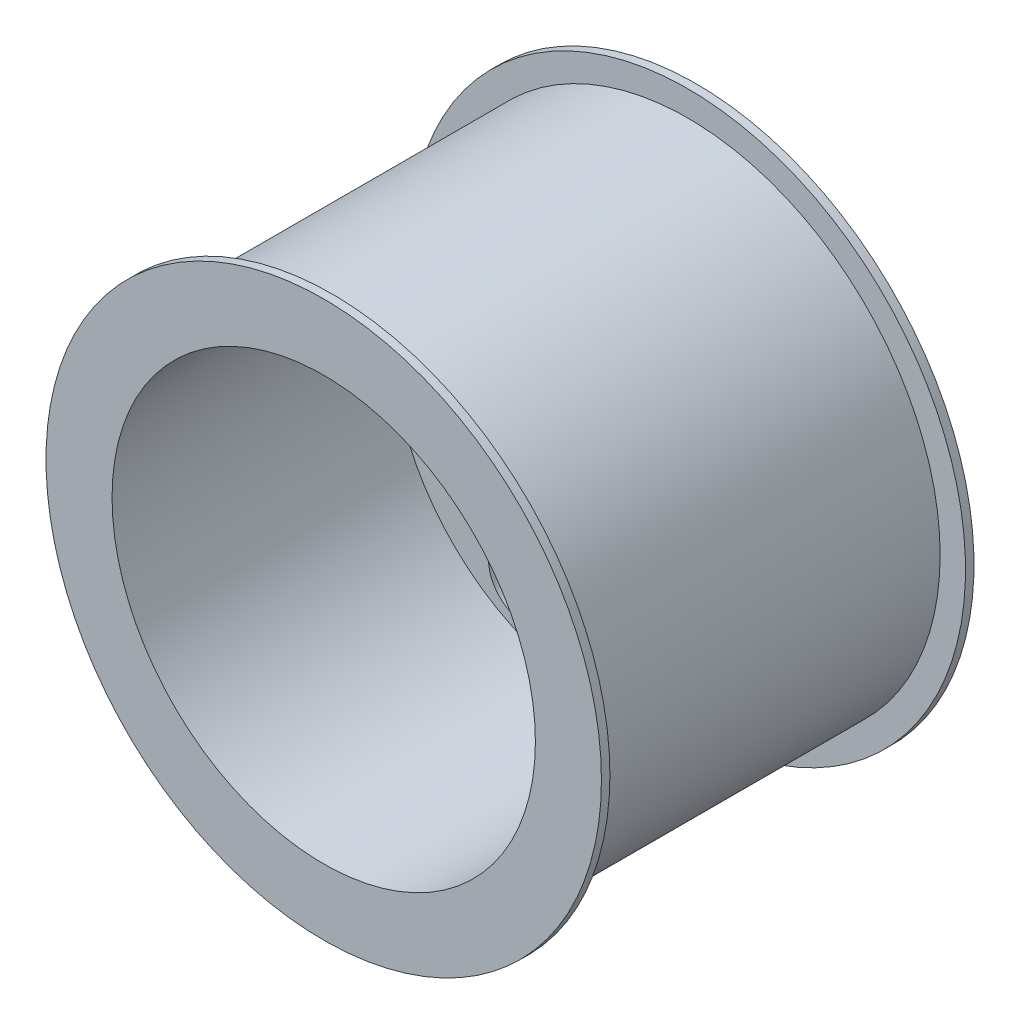
ISO-10303-21;
HEADER;
FILE_DESCRIPTION(('STEP AP214'),'2;1');
FILE_NAME('part.step','',(''),(''),'','','');
FILE_SCHEMA(('AUTOMOTIVE_DESIGN { 1 0 10303 214 1 1 1 1 }'));
ENDSEC;
DATA;
#1=APPLICATION_CONTEXT('core data for automotive mechanical design processes');
#2=APPLICATION_PROTOCOL_DEFINITION('international standard','automotive_design',2000,#1);
#3=PRODUCT_CONTEXT('',#1,'mechanical');
#4=PRODUCT('Part','Part','',(#3));
#5=PRODUCT_RELATED_PRODUCT_CATEGORY('part','',(#4));
#6=PRODUCT_DEFINITION_FORMATION('','',#4);
#7=PRODUCT_DEFINITION_CONTEXT('part definition',#1,'design');
#8=PRODUCT_DEFINITION('design','',#6,#7);
#9=PRODUCT_DEFINITION_SHAPE('','',#8);
#10=(LENGTH_UNIT() NAMED_UNIT(*) SI_UNIT(.MILLI.,.METRE.));
#11=(NAMED_UNIT(*) PLANE_ANGLE_UNIT() SI_UNIT($,.RADIAN.));
#12=(NAMED_UNIT(*) SI_UNIT($,.STERADIAN.) SOLID_ANGLE_UNIT());
#13=UNCERTAINTY_MEASURE_WITH_UNIT(LENGTH_MEASURE(1.E-05),#10,'distance_accuracy_value','');
#14=(GEOMETRIC_REPRESENTATION_CONTEXT(3) GLOBAL_UNCERTAINTY_ASSIGNED_CONTEXT((#13)) GLOBAL_UNIT_ASSIGNED_CONTEXT((#10,
#11,#12)) REPRESENTATION_CONTEXT('',''));
#15=CARTESIAN_POINT('',(0.,0.,0.));
#16=DIRECTION('',(0.,0.,1.));
#17=DIRECTION('',(1.,0.,0.));
#18=AXIS2_PLACEMENT_3D('',#15,#16,#17);
#19=CARTESIAN_POINT('',(0.,0.,1.));
#20=DIRECTION('',(0.,0.,1.));
#21=DIRECTION('',(1.,0.,0.));
#22=AXIS2_PLACEMENT_3D('',#19,#20,#21);
#23=PLANE('',#22);
#24=CARTESIAN_POINT('',(0.,0.,1.));
#25=DIRECTION('',(0.,0.,1.));
#26=DIRECTION('',(1.,0.,0.));
#27=AXIS2_PLACEMENT_3D('',#24,#25,#26);
#28=CIRCLE('',#27,32.8);
#29=CARTESIAN_POINT('',(32.8,0.,1.));
#30=VERTEX_POINT('',#29);
#31=EDGE_CURVE('E119',#30,#30,#28,.T.);
#32=ORIENTED_EDGE('',*,*,#31,.T.);
#33=EDGE_LOOP('',(#32));
#34=FACE_BOUND('',#33,.T.);
#35=CARTESIAN_POINT('',(0.,0.,1.));
#36=DIRECTION('',(0.,0.,1.));
#37=DIRECTION('',(1.,0.,0.));
#38=AXIS2_PLACEMENT_3D('',#35,#36,#37);
#39=CIRCLE('',#38,25.);
#40=CARTESIAN_POINT('',(25.,0.,1.));
#41=VERTEX_POINT('',#40);
#42=EDGE_CURVE('E114',#41,#41,#39,.T.);
#43=ORIENTED_EDGE('',*,*,#42,.F.);
#44=EDGE_LOOP('',(#43));
#45=FACE_BOUND('',#44,.T.);
#46=ADVANCED_FACE('F43',(#34,#45),#23,.T.);
#47=CARTESIAN_POINT('',(0.,0.,0.));
#48=DIRECTION('',(0.,0.,1.));
#49=DIRECTION('',(1.,0.,0.));
#50=AXIS2_PLACEMENT_3D('',#47,#48,#49);
#51=PLANE('',#50);
#52=CARTESIAN_POINT('',(0.,0.,0.));
#53=DIRECTION('',(0.,0.,1.));
#54=DIRECTION('',(1.,0.,0.));
#55=AXIS2_PLACEMENT_3D('',#52,#53,#54);
#56=CIRCLE('',#55,29.8);
#57=CARTESIAN_POINT('',(29.8,0.,0.));
#58=VERTEX_POINT('',#57);
#59=EDGE_CURVE('E113',#58,#58,#56,.T.);
#60=ORIENTED_EDGE('',*,*,#59,.T.);
#61=EDGE_LOOP('',(#60));
#62=FACE_BOUND('',#61,.T.);
#63=CARTESIAN_POINT('',(0.,0.,0.));
#64=DIRECTION('',(0.,0.,1.));
#65=DIRECTION('',(1.,0.,0.));
#66=AXIS2_PLACEMENT_3D('',#63,#64,#65);
#67=CIRCLE('',#66,32.8);
#68=CARTESIAN_POINT('',(32.8,0.,0.));
#69=VERTEX_POINT('',#68);
#70=EDGE_CURVE('E118',#69,#69,#67,.T.);
#71=ORIENTED_EDGE('',*,*,#70,.F.);
#72=EDGE_LOOP('',(#71));
#73=FACE_BOUND('',#72,.T.);
#74=ADVANCED_FACE('F192',(#62,#73),#51,.F.);
#75=CARTESIAN_POINT('',(0.,0.,1.));
#76=DIRECTION('',(0.,0.,-1.));
#77=DIRECTION('',(-1.,0.,0.));
#78=AXIS2_PLACEMENT_3D('',#75,#76,#77);
#79=CYLINDRICAL_SURFACE('',#78,32.8);
#80=ORIENTED_EDGE('',*,*,#31,.F.);
#81=EDGE_LOOP('',(#80));
#82=FACE_BOUND('',#81,.T.);
#83=ORIENTED_EDGE('',*,*,#70,.T.);
#84=EDGE_LOOP('',(#83));
#85=FACE_BOUND('',#84,.T.);
#86=ADVANCED_FACE('F45',(#82,#85),#79,.T.);
#87=CARTESIAN_POINT('',(0.,0.,1.));
#88=DIRECTION('',(0.,0.,-1.));
#89=DIRECTION('',(-1.,0.,0.));
#90=AXIS2_PLACEMENT_3D('',#87,#88,#89);
#91=CYLINDRICAL_SURFACE('',#90,25.);
#92=ORIENTED_EDGE('',*,*,#42,.T.);
#93=EDGE_LOOP('',(#92));
#94=FACE_BOUND('',#93,.T.);
#95=CARTESIAN_POINT('',(0.,0.,-32.));
#96=DIRECTION('',(0.,0.,1.));
#97=DIRECTION('',(1.,0.,0.));
#98=AXIS2_PLACEMENT_3D('',#95,#96,#97);
#99=CIRCLE('',#98,25.);
#100=CARTESIAN_POINT('',(25.,0.,-32.));
#101=VERTEX_POINT('',#100);
#102=EDGE_CURVE('E109',#101,#101,#99,.T.);
#103=ORIENTED_EDGE('',*,*,#102,.F.);
#104=EDGE_LOOP('',(#103));
#105=FACE_BOUND('',#104,.T.);
#106=ADVANCED_FACE('F187',(#94,#105),#91,.F.);
#107=CARTESIAN_POINT('',(0.,0.,-32.));
#108=DIRECTION('',(0.,0.,1.));
#109=DIRECTION('',(1.,0.,0.));
#110=AXIS2_PLACEMENT_3D('',#107,#108,#109);
#111=CYLINDRICAL_SURFACE('',#110,29.8);
#112=CARTESIAN_POINT('',(-27.5808250331206,11.2844180395973,-37.1));
#113=CARTESIAN_POINT('',(-27.5808233058313,11.2844255278698,-36.9323929499502));
#114=CARTESIAN_POINT('',(-27.575447888857,11.2975883421955,-36.7646749268853));
#115=CARTESIAN_POINT('',(-27.5539862225092,11.3498286074411,-36.4339015290692));
#116=CARTESIAN_POINT('',(-27.5378881609234,11.3889346375719,-36.2708515034791));
#117=CARTESIAN_POINT('',(-27.4951603858825,11.4917027589654,-35.9542642315582));
#118=CARTESIAN_POINT('',(-27.4685382642428,11.5553471480039,-35.8007202199531));
#119=CARTESIAN_POINT('',(-27.4050734078043,11.7050643290178,-35.5073373009363));
#120=CARTESIAN_POINT('',(-27.3682325596467,11.7911329807168,-35.3674958701171));
#121=CARTESIAN_POINT('',(-27.2845626824013,11.9834747386879,-35.1045867357193));
#122=CARTESIAN_POINT('',(-27.2376795461966,12.0898569417337,-34.9816160656129));
#123=CARTESIAN_POINT('',(-27.1347294368258,12.3191811671401,-34.7567563531234));
#124=CARTESIAN_POINT('',(-27.0786618585818,12.442124280451,-34.6548687007066));
#125=CARTESIAN_POINT('',(-26.9579511024183,12.7015520616607,-34.4745026304823));
#126=CARTESIAN_POINT('',(-26.893261058046,12.8381096270139,-34.3961603588139));
#127=CARTESIAN_POINT('',(-26.7568496114464,13.1200417932478,-34.2659219527598));
#128=CARTESIAN_POINT('',(-26.6851283158304,13.2654162604297,-34.214025417465));
#129=CARTESIAN_POINT('',(-26.5364962775488,13.5602929729284,-34.138308027073));
#130=CARTESIAN_POINT('',(-26.4595984693177,13.7097844160906,-34.1144197541901));
#131=CARTESIAN_POINT('',(-26.3024811740584,14.0088546505511,-34.0952414605534));
#132=CARTESIAN_POINT('',(-26.222261815146,14.1584334382614,-34.0999503377957));
#133=CARTESIAN_POINT('',(-26.0613190486005,14.4525290218735,-34.137763105333));
#134=CARTESIAN_POINT('',(-25.9806013063596,14.5970702456769,-34.1707012882984));
#135=CARTESIAN_POINT('',(-25.8207439263026,14.8780146921137,-34.2638311692694));
#136=CARTESIAN_POINT('',(-25.7416042787278,15.0144179650807,-34.3240226986917));
#137=CARTESIAN_POINT('',(-25.5876774255549,15.2752641014053,-34.4698417307441));
#138=CARTESIAN_POINT('',(-25.5128842695716,15.3997234758465,-34.5554334301543));
#139=CARTESIAN_POINT('',(-25.370176796521,15.6337116636736,-34.7496585131787));
#140=CARTESIAN_POINT('',(-25.3022626152522,15.7432401823228,-34.8582923515389));
#141=CARTESIAN_POINT('',(-25.1756259017401,15.9449716829662,-35.0959204485136));
#142=CARTESIAN_POINT('',(-25.1169331469343,16.0371187220587,-35.2249780710099));
#143=CARTESIAN_POINT('',(-25.0112686844527,16.2014200348164,-35.4995678004216));
#144=CARTESIAN_POINT('',(-24.9642970916594,16.2735741125258,-35.6451000687892));
#145=CARTESIAN_POINT('',(-24.8838791377055,16.3962793723694,-35.9488196495752));
#146=CARTESIAN_POINT('',(-24.8504577049173,16.4467907478056,-36.1070296509589));
#147=CARTESIAN_POINT('',(-24.798642669892,16.5248157040323,-36.4313823227834));
#148=CARTESIAN_POINT('',(-24.7802488728925,16.5523295828769,-36.5975248903864));
#149=CARTESIAN_POINT('',(-24.7592784747833,16.5836814948811,-36.9327334969352));
#150=CARTESIAN_POINT('',(-24.756675819108,16.5875585276641,-37.1017942584487));
#151=CARTESIAN_POINT('',(-24.7673279698435,16.5716490738568,-37.4382939698992));
#152=CARTESIAN_POINT('',(-24.7805826866052,16.5518627210465,-37.6057329289997));
#153=CARTESIAN_POINT('',(-24.8223686100339,16.4891303436356,-37.9340463079303));
#154=CARTESIAN_POINT('',(-24.8508828015007,16.4462101142681,-38.0949278250753));
#155=CARTESIAN_POINT('',(-24.9219993253665,16.3382405418012,-38.4057820837011));
#156=CARTESIAN_POINT('',(-24.964601861752,16.273190878287,-38.5557546671919));
#157=CARTESIAN_POINT('',(-25.0622636445946,16.1223756012122,-38.8408177753956));
#158=CARTESIAN_POINT('',(-25.1173443744088,16.0365742426102,-38.9758820292758));
#159=CARTESIAN_POINT('',(-25.2377632328754,15.8463857498369,-39.2270193891457));
#160=CARTESIAN_POINT('',(-25.3031014394664,15.7419984744448,-39.3430923508218));
#161=CARTESIAN_POINT('',(-25.4416328257185,15.5171113066712,-39.5530593403544));
#162=CARTESIAN_POINT('',(-25.5148333661481,15.3965962889759,-39.6469323165647));
#163=CARTESIAN_POINT('',(-25.6663798780783,15.142614749635,-39.8096737332536));
#164=CARTESIAN_POINT('',(-25.74472573422,15.0091485183258,-39.8785427341));
#165=CARTESIAN_POINT('',(-25.9036397812163,14.7331839370334,-39.9891511716175));
#166=CARTESIAN_POINT('',(-25.9842013286975,14.5907112118045,-40.0309640829627));
#167=CARTESIAN_POINT('',(-26.1451484865239,14.3003062130653,-40.0865763771767));
#168=CARTESIAN_POINT('',(-26.2255340999795,14.1523740369118,-40.1003762593475));
#169=CARTESIAN_POINT('',(-26.3835390568202,13.8555787932831,-40.0996090170452));
#170=CARTESIAN_POINT('',(-26.461164646919,13.7067188609448,-40.0851107351279));
#171=CARTESIAN_POINT('',(-26.6117713305376,13.411973340826,-40.028353594461));
#172=CARTESIAN_POINT('',(-26.6847523305945,13.2660878129395,-39.9860941772694));
#173=CARTESIAN_POINT('',(-26.824546177643,12.9811020083382,-39.8748913446533));
#174=CARTESIAN_POINT('',(-26.8913395145593,12.8420238049813,-39.8058668630194));
#175=CARTESIAN_POINT('',(-27.017116832952,12.5752603583761,-39.6431162089852));
#176=CARTESIAN_POINT('',(-27.0761007588394,12.4475751962278,-39.5493898607661));
#177=CARTESIAN_POINT('',(-27.1855204925496,12.2067643830115,-39.3392468483135));
#178=CARTESIAN_POINT('',(-27.2359054227944,12.0937262811652,-39.222703339038));
#179=CARTESIAN_POINT('',(-27.3269420484751,11.8865922289364,-38.9704851171803));
#180=CARTESIAN_POINT('',(-27.3675914707601,11.7925007032189,-38.8348059483261));
#181=CARTESIAN_POINT('',(-27.4386212339376,11.6262748628595,-38.5480302370837));
#182=CARTESIAN_POINT('',(-27.4689935568536,11.5541576964941,-38.3969217761772));
#183=CARTESIAN_POINT('',(-27.5190337437166,11.4344667402133,-38.0837540606929));
#184=CARTESIAN_POINT('',(-27.5387140319932,11.3868644669326,-37.9217077634115));
#185=CARTESIAN_POINT('',(-27.5622322621853,11.3297797783758,-37.6489313947057));
#186=CARTESIAN_POINT('',(-27.5692001701338,11.3127960336867,-37.5399732147102));
#187=CARTESIAN_POINT('',(-27.5784971067504,11.29011274149,-37.3206927233836));
#188=CARTESIAN_POINT('',(-27.5808261705528,11.2844131085171,-37.2103704223905));
#189=CARTESIAN_POINT('',(-27.5808250331206,11.2844180395973,-37.1));
#190=B_SPLINE_CURVE_WITH_KNOTS('',3,(#112,#113,#114,#115,#116,#117,#118,#119,#120,#121,#122,
#123,#124,#125,#126,#127,#128,#129,#130,#131,#132,#133,#134,#135,#136,#137,#138,#139,#140,#141,
#142,#143,#144,#145,#146,#147,#148,#149,#150,#151,#152,#153,#154,#155,#156,#157,#158,#159,#160,
#161,#162,#163,#164,#165,#166,#167,#168,#169,#170,#171,#172,#173,#174,#175,#176,#177,#178,#179,
#180,#181,#182,#183,#184,#185,#186,#187,#188,#189),.UNSPECIFIED.,.T.,.F.,(4,2,2,2,2,2,2,2,2,2,2,
2,2,2,2,2,2,2,2,2,2,2,2,2,2,2,2,2,2,2,2,2,2,2,2,2,2,2,4),(0.,0.50241700148323,1.00538838980818,
1.50799760628625,2.01051408980284,2.51580944240425,3.0211380976377,3.52933485044635,
4.03752389891981,4.54448717411758,5.05143091338388,5.55541909306666,6.05940415523036,
6.56268216438254,7.06597010685531,7.57085124632446,8.07573733408052,8.58154809673458,
9.0873523038367,9.59232173273815,10.0972883068302,10.6016929835344,11.1061049638851,
11.6113920665796,12.1166830087405,12.622451200382,13.1282080564822,13.6325856285908,
14.1369542106344,14.6400973157439,15.1432505423722,15.647939778795,16.152632607509,
16.6602151510623,17.1679160951466,17.6760122284256,18.1835166754485,18.5143643137094,
18.8452094461391),.UNSPECIFIED.);
#191=CARTESIAN_POINT('',(-27.5808250331206,11.2844180395973,-37.1));
#192=VERTEX_POINT('',#191);
#193=EDGE_CURVE('E70',#192,#192,#190,.T.);
#194=ORIENTED_EDGE('',*,*,#193,.F.);
#195=EDGE_LOOP('',(#194));
#196=FACE_BOUND('',#195,.T.);
#197=ORIENTED_EDGE('',*,*,#59,.F.);
#198=EDGE_LOOP('',(#197));
#199=FACE_BOUND('',#198,.T.);
#200=CARTESIAN_POINT('',(0.,0.,-42.));
#201=DIRECTION('',(0.,0.,-1.));
#202=DIRECTION('',(-1.,0.,0.));
#203=AXIS2_PLACEMENT_3D('',#200,#201,#202);
#204=CIRCLE('',#203,29.8);
#205=CARTESIAN_POINT('',(-29.8,0.,-42.));
#206=VERTEX_POINT('',#205);
#207=EDGE_CURVE('E104',#206,#206,#204,.T.);
#208=ORIENTED_EDGE('',*,*,#207,.F.);
#209=EDGE_LOOP('',(#208));
#210=FACE_BOUND('',#209,.T.);
#211=ADVANCED_FACE('F136',(#196,#199,#210),#111,.T.);
#212=CARTESIAN_POINT('',(0.,0.,-32.));
#213=DIRECTION('',(0.,0.,-1.));
#214=DIRECTION('',(-1.,0.,0.));
#215=AXIS2_PLACEMENT_3D('',#212,#213,#214);
#216=PLANE('',#215);
#217=CARTESIAN_POINT('',(9.08685125502355,17.1402781269453,-32.));
#218=DIRECTION('',(0.,0.,-1.));
#219=DIRECTION('',(-1.,0.,0.));
#220=AXIS2_PLACEMENT_3D('',#217,#218,#219);
#221=CIRCLE('',#220,4.45000000000122);
#222=CARTESIAN_POINT('',(4.63685125502233,17.1402781269453,-32.));
#223=VERTEX_POINT('',#222);
#224=EDGE_CURVE('E98',#223,#223,#221,.T.);
#225=ORIENTED_EDGE('',*,*,#224,.T.);
#226=EDGE_LOOP('',(#225));
#227=FACE_BOUND('',#226,.T.);
#228=CARTESIAN_POINT('',(19.3873419133772,0.700695036210699,-32.));
#229=DIRECTION('',(0.,0.,-1.));
#230=DIRECTION('',(-1.,0.,0.));
#231=AXIS2_PLACEMENT_3D('',#228,#229,#230);
#232=CIRCLE('',#231,4.45000000000188);
#233=CARTESIAN_POINT('',(14.9373419133754,0.700695036210699,-32.));
#234=VERTEX_POINT('',#233);
#235=EDGE_CURVE('E429',#234,#234,#232,.T.);
#236=ORIENTED_EDGE('',*,*,#235,.T.);
#237=EDGE_LOOP('',(#236));
#238=FACE_BOUND('',#237,.T.);
#239=CARTESIAN_POINT('',(10.3004906583528,-16.4395830907352,-32.));
#240=DIRECTION('',(0.,0.,-1.));
#241=DIRECTION('',(-1.,0.,0.));
#242=AXIS2_PLACEMENT_3D('',#239,#240,#241);
#243=CIRCLE('',#242,4.45000000000149);
#244=CARTESIAN_POINT('',(5.8504906583513,-16.4395830907352,-32.));
#245=VERTEX_POINT('',#244);
#246=EDGE_CURVE('E425',#245,#245,#243,.T.);
#247=ORIENTED_EDGE('',*,*,#246,.T.);
#248=EDGE_LOOP('',(#247));
#249=FACE_BOUND('',#248,.T.);
#250=CARTESIAN_POINT('',(-9.08685125502536,-17.1402781269465,-32.));
#251=DIRECTION('',(0.,0.,-1.));
#252=DIRECTION('',(-1.,0.,0.));
#253=AXIS2_PLACEMENT_3D('',#250,#251,#252);
#254=CIRCLE('',#253,4.45000000000041);
#255=CARTESIAN_POINT('',(-13.5368512550258,-17.1402781269465,-32.));
#256=VERTEX_POINT('',#255);
#257=EDGE_CURVE('E421',#256,#256,#254,.T.);
#258=ORIENTED_EDGE('',*,*,#257,.T.);
#259=EDGE_LOOP('',(#258));
#260=FACE_BOUND('',#259,.T.);
#261=CARTESIAN_POINT('',(-19.3873419133791,-0.70069503621186,-32.));
#262=DIRECTION('',(0.,0.,-1.));
#263=DIRECTION('',(-1.,0.,0.));
#264=AXIS2_PLACEMENT_3D('',#261,#262,#263);
#265=CIRCLE('',#264,4.44999999999967);
#266=CARTESIAN_POINT('',(-23.8373419133787,-0.70069503621186,-32.));
#267=VERTEX_POINT('',#266);
#268=EDGE_CURVE('E417',#267,#267,#265,.T.);
#269=ORIENTED_EDGE('',*,*,#268,.T.);
#270=EDGE_LOOP('',(#269));
#271=FACE_BOUND('',#270,.T.);
#272=CARTESIAN_POINT('',(-10.3004906583546,16.4395830907341,-32.));
#273=DIRECTION('',(0.,0.,-1.));
#274=DIRECTION('',(-1.,0.,0.));
#275=AXIS2_PLACEMENT_3D('',#272,#273,#274);
#276=CIRCLE('',#275,4.45);
#277=CARTESIAN_POINT('',(-14.7504906583546,16.4395830907341,-32.));
#278=VERTEX_POINT('',#277);
#279=EDGE_CURVE('E413',#278,#278,#276,.T.);
#280=ORIENTED_EDGE('',*,*,#279,.T.);
#281=EDGE_LOOP('',(#280));
#282=FACE_BOUND('',#281,.T.);
#283=CARTESIAN_POINT('',(0.,0.,-32.));
#284=DIRECTION('',(0.,0.,-1.));
#285=DIRECTION('',(-1.,0.,0.));
#286=AXIS2_PLACEMENT_3D('',#283,#284,#285);
#287=CIRCLE('',#286,2.95);
#288=CARTESIAN_POINT('',(-2.95,0.,-32.));
#289=VERTEX_POINT('',#288);
#290=EDGE_CURVE('E88',#289,#289,#287,.T.);
#291=ORIENTED_EDGE('',*,*,#290,.T.);
#292=EDGE_LOOP('',(#291));
#293=FACE_BOUND('',#292,.T.);
#294=ORIENTED_EDGE('',*,*,#102,.T.);
#295=EDGE_LOOP('',(#294));
#296=FACE_BOUND('',#295,.T.);
#297=ADVANCED_FACE('F180',(#227,#238,#249,#260,#271,#282,#293,#296),#216,.F.);
#298=CARTESIAN_POINT('',(0.,0.,-43.));
#299=DIRECTION('',(0.,0.,1.));
#300=DIRECTION('',(1.,0.,0.));
#301=AXIS2_PLACEMENT_3D('',#298,#299,#300);
#302=CYLINDRICAL_SURFACE('',#301,32.8);
#303=CARTESIAN_POINT('',(0.,0.,-43.));
#304=DIRECTION('',(0.,0.,-1.));
#305=DIRECTION('',(-1.,0.,0.));
#306=AXIS2_PLACEMENT_3D('',#303,#304,#305);
#307=CIRCLE('',#306,32.8);
#308=CARTESIAN_POINT('',(-32.8,0.,-43.));
#309=VERTEX_POINT('',#308);
#310=EDGE_CURVE('E96',#309,#309,#307,.T.);
#311=ORIENTED_EDGE('',*,*,#310,.F.);
#312=EDGE_LOOP('',(#311));
#313=FACE_BOUND('',#312,.T.);
#314=CARTESIAN_POINT('',(0.,0.,-42.));
#315=DIRECTION('',(0.,0.,-1.));
#316=DIRECTION('',(-1.,0.,0.));
#317=AXIS2_PLACEMENT_3D('',#314,#315,#316);
#318=CIRCLE('',#317,32.8);
#319=CARTESIAN_POINT('',(-32.8,0.,-42.));
#320=VERTEX_POINT('',#319);
#321=EDGE_CURVE('E91',#320,#320,#318,.T.);
#322=ORIENTED_EDGE('',*,*,#321,.T.);
#323=EDGE_LOOP('',(#322));
#324=FACE_BOUND('',#323,.T.);
#325=ADVANCED_FACE('F174',(#313,#324),#302,.T.);
#326=CARTESIAN_POINT('',(0.,0.,-43.));
#327=DIRECTION('',(0.,0.,-1.));
#328=DIRECTION('',(-1.,0.,0.));
#329=AXIS2_PLACEMENT_3D('',#326,#327,#328);
#330=PLANE('',#329);
#331=CARTESIAN_POINT('',(9.08685125502355,17.1402781269453,-43.));
#332=DIRECTION('',(0.,0.,-1.));
#333=DIRECTION('',(-1.,0.,0.));
#334=AXIS2_PLACEMENT_3D('',#331,#332,#333);
#335=CIRCLE('',#334,4.45000000000122);
#336=CARTESIAN_POINT('',(4.63685125502233,17.1402781269453,-43.));
#337=VERTEX_POINT('',#336);
#338=EDGE_CURVE('E389',#337,#337,#335,.T.);
#339=ORIENTED_EDGE('',*,*,#338,.F.);
#340=EDGE_LOOP('',(#339));
#341=FACE_BOUND('',#340,.T.);
#342=CARTESIAN_POINT('',(19.3873419133772,0.700695036210699,-43.));
#343=DIRECTION('',(0.,0.,-1.));
#344=DIRECTION('',(-1.,0.,0.));
#345=AXIS2_PLACEMENT_3D('',#342,#343,#344);
#346=CIRCLE('',#345,4.45000000000188);
#347=CARTESIAN_POINT('',(14.9373419133754,0.700695036210699,-43.));
#348=VERTEX_POINT('',#347);
#349=EDGE_CURVE('E403',#348,#348,#346,.T.);
#350=ORIENTED_EDGE('',*,*,#349,.F.);
#351=EDGE_LOOP('',(#350));
#352=FACE_BOUND('',#351,.T.);
#353=CARTESIAN_POINT('',(10.3004906583528,-16.4395830907352,-43.));
#354=DIRECTION('',(0.,0.,-1.));
#355=DIRECTION('',(-1.,0.,0.));
#356=AXIS2_PLACEMENT_3D('',#353,#354,#355);
#357=CIRCLE('',#356,4.45000000000149);
#358=CARTESIAN_POINT('',(5.8504906583513,-16.4395830907352,-43.));
#359=VERTEX_POINT('',#358);
#360=EDGE_CURVE('E399',#359,#359,#357,.T.);
#361=ORIENTED_EDGE('',*,*,#360,.F.);
#362=EDGE_LOOP('',(#361));
#363=FACE_BOUND('',#362,.T.);
#364=CARTESIAN_POINT('',(-9.08685125502536,-17.1402781269465,-43.));
#365=DIRECTION('',(0.,0.,-1.));
#366=DIRECTION('',(-1.,0.,0.));
#367=AXIS2_PLACEMENT_3D('',#364,#365,#366);
#368=CIRCLE('',#367,4.45000000000041);
#369=CARTESIAN_POINT('',(-13.5368512550258,-17.1402781269465,-43.));
#370=VERTEX_POINT('',#369);
#371=EDGE_CURVE('E395',#370,#370,#368,.T.);
#372=ORIENTED_EDGE('',*,*,#371,.F.);
#373=EDGE_LOOP('',(#372));
#374=FACE_BOUND('',#373,.T.);
#375=CARTESIAN_POINT('',(-19.3873419133791,-0.70069503621186,-43.));
#376=DIRECTION('',(0.,0.,-1.));
#377=DIRECTION('',(-1.,0.,0.));
#378=AXIS2_PLACEMENT_3D('',#375,#376,#377);
#379=CIRCLE('',#378,4.44999999999967);
#380=CARTESIAN_POINT('',(-23.8373419133787,-0.70069503621186,-43.));
#381=VERTEX_POINT('',#380);
#382=EDGE_CURVE('E390',#381,#381,#379,.T.);
#383=ORIENTED_EDGE('',*,*,#382,.F.);
#384=EDGE_LOOP('',(#383));
#385=FACE_BOUND('',#384,.T.);
#386=CARTESIAN_POINT('',(-10.3004906583546,16.4395830907341,-43.));
#387=DIRECTION('',(0.,0.,-1.));
#388=DIRECTION('',(-1.,0.,0.));
#389=AXIS2_PLACEMENT_3D('',#386,#387,#388);
#390=CIRCLE('',#389,4.45);
#391=CARTESIAN_POINT('',(-14.7504906583546,16.4395830907341,-43.));
#392=VERTEX_POINT('',#391);
#393=EDGE_CURVE('E394',#392,#392,#390,.T.);
#394=ORIENTED_EDGE('',*,*,#393,.F.);
#395=EDGE_LOOP('',(#394));
#396=FACE_BOUND('',#395,.T.);
#397=CARTESIAN_POINT('',(0.,0.,-43.));
#398=DIRECTION('',(0.,0.,-1.));
#399=DIRECTION('',(-1.,0.,0.));
#400=AXIS2_PLACEMENT_3D('',#397,#398,#399);
#401=CIRCLE('',#400,2.95);
#402=CARTESIAN_POINT('',(-2.95,0.,-43.));
#403=VERTEX_POINT('',#402);
#404=EDGE_CURVE('E85',#403,#403,#401,.T.);
#405=ORIENTED_EDGE('',*,*,#404,.F.);
#406=EDGE_LOOP('',(#405));
#407=FACE_BOUND('',#406,.T.);
#408=ORIENTED_EDGE('',*,*,#310,.T.);
#409=EDGE_LOOP('',(#408));
#410=FACE_BOUND('',#409,.T.);
#411=ADVANCED_FACE('F171',(#341,#352,#363,#374,#385,#396,#407,#410),#330,.T.);
#412=CARTESIAN_POINT('',(0.,0.,-42.));
#413=DIRECTION('',(0.,0.,-1.));
#414=DIRECTION('',(-1.,0.,0.));
#415=AXIS2_PLACEMENT_3D('',#412,#413,#414);
#416=PLANE('',#415);
#417=ORIENTED_EDGE('',*,*,#207,.T.);
#418=EDGE_LOOP('',(#417));
#419=FACE_BOUND('',#418,.T.);
#420=ORIENTED_EDGE('',*,*,#321,.F.);
#421=EDGE_LOOP('',(#420));
#422=FACE_BOUND('',#421,.T.);
#423=ADVANCED_FACE('F81',(#419,#422),#416,.F.);
#424=CARTESIAN_POINT('',(0.,0.,1.));
#425=DIRECTION('',(0.,0.,-1.));
#426=DIRECTION('',(-1.,0.,0.));
#427=AXIS2_PLACEMENT_3D('',#424,#425,#426);
#428=CYLINDRICAL_SURFACE('',#427,2.95);
#429=DIRECTION('',(0.,0.,-1.));
#430=VECTOR('',#429,1.);
#431=CARTESIAN_POINT('',(-0.924554069132945,-2.80137462208283,1.));
#432=LINE('',#431,#430);
#433=CARTESIAN_POINT('',(-0.924554069132945,-2.80137462208283,-35.4413380586072));
#434=VERTEX_POINT('',#433);
#435=CARTESIAN_POINT('',(-0.924554069132945,-2.80137462208283,-38.7586619413928));
#436=VERTEX_POINT('',#435);
#437=EDGE_CURVE('E58',#434,#436,#432,.T.);
#438=ORIENTED_EDGE('',*,*,#437,.F.);
#439=CARTESIAN_POINT('',(-0.924554069132944,-2.80137462208283,-35.4413380586072));
#440=CARTESIAN_POINT('',(-0.977724028136216,-2.78383421362048,-35.4542005300813));
#441=CARTESIAN_POINT('',(-1.03073605928525,-2.76465211681264,-35.4656138422582));
#442=CARTESIAN_POINT('',(-1.1361399071723,-2.72302940922627,-35.4850864765972));
#443=CARTESIAN_POINT('',(-1.18853117180395,-2.70058610341282,-35.4931430032351));
#444=CARTESIAN_POINT('',(-1.2917902135637,-2.65273120175159,-35.5053631872987));
#445=CARTESIAN_POINT('',(-1.34266789787824,-2.62735091019045,-35.5095642863867));
#446=CARTESIAN_POINT('',(-1.44297336442512,-2.57363003109093,-35.5139787401407));
#447=CARTESIAN_POINT('',(-1.49240173139377,-2.54529065906142,-35.5141937257627));
#448=CARTESIAN_POINT('',(-1.63833185919841,-2.45588271225161,-35.5087435694753));
#449=CARTESIAN_POINT('',(-1.73211444426775,-2.3905930161445,-35.4969392177278));
#450=CARTESIAN_POINT('',(-1.90985079325544,-2.25118353869261,-35.4595822354517));
#451=CARTESIAN_POINT('',(-1.99378289033809,-2.17704498978955,-35.4339999650135));
#452=CARTESIAN_POINT('',(-2.18665797401833,-1.98665878428328,-35.359918002166));
#453=CARTESIAN_POINT('',(-2.28974458927471,-1.86653129131131,-35.3062862530097));
#454=CARTESIAN_POINT('',(-2.47443552352542,-1.61378312446144,-35.191403685094));
#455=CARTESIAN_POINT('',(-2.55596864091595,-1.48112296049887,-35.1301285739447));
#456=CARTESIAN_POINT('',(-2.70056694543097,-1.1982196700758,-35.0060783598411));
#457=CARTESIAN_POINT('',(-2.76267901173578,-1.04746378287241,-34.9433532799012));
#458=CARTESIAN_POINT('',(-2.86173684869911,-0.734654875159883,-34.8274331444005));
#459=CARTESIAN_POINT('',(-2.89875207762407,-0.572634414045168,-34.7742120890172));
#460=CARTESIAN_POINT('',(-2.93886498173742,-0.284225381291184,-34.6971529483043));
#461=CARTESIAN_POINT('',(-2.94836272823542,-0.15981217942823,-34.6692649257428));
#462=CARTESIAN_POINT('',(-2.95124259597132,0.0915691719794021,-34.6263738680382));
#463=CARTESIAN_POINT('',(-2.94463396093306,0.218535814581884,-34.6113634489066));
#464=CARTESIAN_POINT('',(-2.92226901671538,0.408650702454977,-34.6008970977632));
#465=CARTESIAN_POINT('',(-2.91266293999675,0.472267798054225,-34.5994387695928));
#466=CARTESIAN_POINT('',(-2.88932622949522,0.598676499038659,-34.6009470101981));
#467=CARTESIAN_POINT('',(-2.87559767733366,0.661468504385644,-34.6039113487633));
#468=CARTESIAN_POINT('',(-2.84418360022153,0.785632783570144,-34.6145246370242));
#469=CARTESIAN_POINT('',(-2.8264994611491,0.847005546363582,-34.622171947622));
#470=CARTESIAN_POINT('',(-2.78747319030269,0.967742663976498,-34.6422869760973));
#471=CARTESIAN_POINT('',(-2.76613149732088,1.02710725869164,-34.654754115971));
#472=CARTESIAN_POINT('',(-2.7030394832056,1.18655241964779,-34.6956753697099));
#473=CARTESIAN_POINT('',(-2.65791344333353,1.28408661351869,-34.7291239311467));
#474=CARTESIAN_POINT('',(-2.56039200992724,1.46896409699966,-34.8102570183465));
#475=CARTESIAN_POINT('',(-2.50799548540202,1.55630579717404,-34.857943760322));
#476=CARTESIAN_POINT('',(-2.39873470751175,1.7199724410173,-34.9665031495572));
#477=CARTESIAN_POINT('',(-2.34184901831874,1.79623888737118,-35.027441847366));
#478=CARTESIAN_POINT('',(-2.22692766127439,1.93689380048916,-35.1607858191156));
#479=CARTESIAN_POINT('',(-2.16889161725335,2.00127830841873,-35.2331948998895));
#480=CARTESIAN_POINT('',(-2.04633530214309,2.12691739701656,-35.3991443213708));
#481=CARTESIAN_POINT('',(-1.98208079371893,2.18639455524,-35.4942259708014));
#482=CARTESIAN_POINT('',(-1.85988666627519,2.2912483586995,-35.6956785278049));
#483=CARTESIAN_POINT('',(-1.80195445364064,2.33660857908738,-35.8020623938182));
#484=CARTESIAN_POINT('',(-1.68967728588732,2.41929110028173,-36.038929196964));
#485=CARTESIAN_POINT('',(-1.63677892626087,2.45480061036248,-36.1707468969539));
#486=CARTESIAN_POINT('',(-1.550400503077,2.51026607440331,-36.4436432470147));
#487=CARTESIAN_POINT('',(-1.51689560513733,2.53024193136581,-36.5847097944281));
#488=CARTESIAN_POINT('',(-1.47550870702153,2.55459007726854,-36.8626072626537));
#489=CARTESIAN_POINT('',(-1.46611961075435,2.55988190501669,-36.9991285542094));
#490=CARTESIAN_POINT('',(-1.47000031481361,2.55765654440899,-37.2717220817515));
#491=CARTESIAN_POINT('',(-1.48326495012724,2.55014227582246,-37.4077944130133));
#492=CARTESIAN_POINT('',(-1.52805868879416,2.52350997201067,-37.6613934971442));
#493=CARTESIAN_POINT('',(-1.55762498866175,2.50562978096305,-37.7794125427448));
#494=CARTESIAN_POINT('',(-1.63040438798881,2.45889121294542,-38.0088789830233));
#495=CARTESIAN_POINT('',(-1.67362432050709,2.43002733762875,-38.1203230539946));
#496=CARTESIAN_POINT('',(-1.77511127473598,2.35706535686255,-38.3457660392346));
#497=CARTESIAN_POINT('',(-1.83446131084366,2.31171684853072,-38.4588729484996));
#498=CARTESIAN_POINT('',(-1.96076135694611,2.20561476739205,-38.6730661268445));
#499=CARTESIAN_POINT('',(-2.02771737451929,2.14484896986729,-38.7741427629739));
#500=CARTESIAN_POINT('',(-2.17030898998019,2.00082730972438,-38.9700321029951));
#501=CARTESIAN_POINT('',(-2.24620284107225,1.91611889707231,-39.0636202133394));
#502=CARTESIAN_POINT('',(-2.3576560118322,1.77414711438595,-39.1888893313091));
#503=CARTESIAN_POINT('',(-2.39441242891485,1.72433302058591,-39.2281297976453));
#504=CARTESIAN_POINT('',(-2.46630883439795,1.61982439461852,-39.3011861476836));
#505=CARTESIAN_POINT('',(-2.50145000708836,1.56513352745775,-39.3350060524711));
#506=CARTESIAN_POINT('',(-2.56514001615681,1.45806506308201,-39.3930740335452));
#507=CARTESIAN_POINT('',(-2.59397103451136,1.40621389972139,-39.4179858458575));
#508=CARTESIAN_POINT('',(-2.64914886573693,1.29927934820534,-39.4631016302717));
#509=CARTESIAN_POINT('',(-2.67549713634977,1.24419788793024,-39.4833083753308));
#510=CARTESIAN_POINT('',(-2.72518737876682,1.1312192906477,-39.5188817537759));
#511=CARTESIAN_POINT('',(-2.74853087897956,1.07332360593745,-39.534250853678));
#512=CARTESIAN_POINT('',(-2.79177340102317,0.955229692195083,-39.5601308036094));
#513=CARTESIAN_POINT('',(-2.8116727607194,0.895031689725297,-39.5706421303487));
#514=CARTESIAN_POINT('',(-2.86071326990973,0.728582755543625,-39.5927575562847));
#515=CARTESIAN_POINT('',(-2.88611472391239,0.620543818721574,-39.5996430486973));
#516=CARTESIAN_POINT('',(-2.92453918342433,0.40234482763896,-39.6003308374794));
#517=CARTESIAN_POINT('',(-2.93755994890176,0.292184393214015,-39.5941307669376));
#518=CARTESIAN_POINT('',(-2.9514150598572,0.0683557704602393,-39.5701484674581));
#519=CARTESIAN_POINT('',(-2.951790452986,-0.0452947874154472,-39.551954460895));
#520=CARTESIAN_POINT('',(-2.93978458324368,-0.269893426599201,-39.5060547437549));
#521=CARTESIAN_POINT('',(-2.92739914916475,-0.38084061210123,-39.4783459249888));
#522=CARTESIAN_POINT('',(-2.88145047127845,-0.653750720722366,-39.4000822853683));
#523=CARTESIAN_POINT('',(-2.84034921429068,-0.813169498886923,-39.3450577524453));
#524=CARTESIAN_POINT('',(-2.73365341785679,-1.12086662006868,-39.2267995237482));
#525=CARTESIAN_POINT('',(-2.6679645727329,-1.2690993943067,-39.1635348400357));
#526=CARTESIAN_POINT('',(-2.55117722175838,-1.48350673968226,-39.0681273291679));
#527=CARTESIAN_POINT('',(-2.50862615727546,-1.55439445140268,-39.0358780636741));
#528=CARTESIAN_POINT('',(-2.41742273455395,-1.69276466492272,-38.9727429352745));
#529=CARTESIAN_POINT('',(-2.36876856440635,-1.76024614709192,-38.941857480958));
#530=CARTESIAN_POINT('',(-2.21389934819905,-1.95673626258159,-38.8537268844938));
#531=CARTESIAN_POINT('',(-2.09829615604278,-2.08068344372268,-38.8005767067013));
#532=CARTESIAN_POINT('',(-1.88950514573224,-2.26804893827271,-38.7354950127897));
#533=CARTESIAN_POINT('',(-1.80374369160552,-2.33694675909917,-38.7155921818307));
#534=CARTESIAN_POINT('',(-1.62354808572561,-2.46551835723107,-38.6901756326174));
#535=CARTESIAN_POINT('',(-1.52912364851747,-2.52520227010104,-38.6846459958061));
#536=CARTESIAN_POINT('',(-1.35030971907014,-2.62447568794115,-38.6888117266159));
#537=CARTESIAN_POINT('',(-1.26679204807041,-2.6657548010218,-38.6961731415058));
#538=CARTESIAN_POINT('',(-1.13968836017741,-2.72135457019545,-38.7144942225092));
#539=CARTESIAN_POINT('',(-1.09691349992696,-2.73886825519608,-38.7218402422603));
#540=CARTESIAN_POINT('',(-1.01098567693846,-2.77173616376216,-38.7386963395266));
#541=CARTESIAN_POINT('',(-0.967832917861816,-2.78709148259144,-38.7482053129889));
#542=CARTESIAN_POINT('',(-0.924554069132945,-2.80137462208283,-38.7586619413928));
#543=B_SPLINE_CURVE_WITH_KNOTS('',3,(#439,#440,#441,#442,#443,#444,#445,#446,#447,#448,#449,
#450,#451,#452,#453,#454,#455,#456,#457,#458,#459,#460,#461,#462,#463,#464,#465,#466,#467,#468,
#469,#470,#471,#472,#473,#474,#475,#476,#477,#478,#479,#480,#481,#482,#483,#484,#485,#486,#487,
#488,#489,#490,#491,#492,#493,#494,#495,#496,#497,#498,#499,#500,#501,#502,#503,#504,#505,#506,
#507,#508,#509,#510,#511,#512,#513,#514,#515,#516,#517,#518,#519,#520,#521,#522,#523,#524,#525,
#526,#527,#528,#529,#530,#531,#532,#533,#534,#535,#536,#537,#538,#539,#540,#541,#542),
.UNSPECIFIED.,.F.,.F.,(4,2,2,2,2,2,2,2,2,2,2,2,2,2,2,2,2,2,2,2,2,2,2,2,2,2,2,2,2,2,2,2,2,2,2,2,
2,2,2,2,2,2,2,2,2,2,2,2,2,2,2,4),(0.,0.172345119246252,0.344833481654526,0.515628442640555,
0.68635351971595,1.02899646317219,1.37237948290887,1.87106360519656,2.37137509787505,
2.89336171486499,3.41389771396034,3.79607896836695,4.17804093416652,4.370862279888,
4.56358642478573,4.756243152386,4.94887678335865,5.2847432770349,5.62066207654052,
5.95829519310821,6.29604060027198,6.68229084854892,7.06898882757208,7.50598237146481,
7.94241507623927,8.35082468315878,8.75914118580341,9.12655361912695,9.49415021871745,
9.89911638028135,10.3044046577377,10.7434788490275,10.9630566317667,11.1824707655987,
11.3752233658195,11.567862077063,11.7604024100615,11.9529238444042,12.2848306451115,
12.6167974861317,12.9608002620983,13.3049155199928,13.8228810388034,14.342853917597,
14.6088269115043,14.8748790560221,15.40371154268,15.7377668990489,16.0714521254819,
16.3507666987795,16.491083402012,16.631328642411),.UNSPECIFIED.);
#544=EDGE_CURVE('E11',#434,#436,#543,.T.);
#545=ORIENTED_EDGE('',*,*,#544,.T.);
#546=EDGE_LOOP('',(#438,#545));
#547=FACE_BOUND('',#546,.T.);
#548=ORIENTED_EDGE('',*,*,#404,.T.);
#549=EDGE_LOOP('',(#548));
#550=FACE_BOUND('',#549,.T.);
#551=ORIENTED_EDGE('',*,*,#290,.F.);
#552=EDGE_LOOP('',(#551));
#553=FACE_BOUND('',#552,.T.);
#554=ADVANCED_FACE('F77',(#547,#550,#553),#428,.F.);
#555=CARTESIAN_POINT('',(-10.3004906583546,16.4395830907341,1.));
#556=DIRECTION('',(0.,0.,-1.));
#557=DIRECTION('',(-1.,0.,0.));
#558=AXIS2_PLACEMENT_3D('',#555,#556,#557);
#559=CYLINDRICAL_SURFACE('',#558,4.45);
#560=ORIENTED_EDGE('',*,*,#393,.T.);
#561=EDGE_LOOP('',(#560));
#562=FACE_BOUND('',#561,.T.);
#563=ORIENTED_EDGE('',*,*,#279,.F.);
#564=EDGE_LOOP('',(#563));
#565=FACE_BOUND('',#564,.T.);
#566=ADVANCED_FACE('F80',(#562,#565),#559,.F.);
#567=CARTESIAN_POINT('',(-19.3873419133791,-0.70069503621186,1.));
#568=DIRECTION('',(0.,0.,-1.));
#569=DIRECTION('',(-1.,0.,0.));
#570=AXIS2_PLACEMENT_3D('',#567,#568,#569);
#571=CYLINDRICAL_SURFACE('',#570,4.44999999999967);
#572=ORIENTED_EDGE('',*,*,#382,.T.);
#573=EDGE_LOOP('',(#572));
#574=FACE_BOUND('',#573,.T.);
#575=ORIENTED_EDGE('',*,*,#268,.F.);
#576=EDGE_LOOP('',(#575));
#577=FACE_BOUND('',#576,.T.);
#578=ADVANCED_FACE('F148',(#574,#577),#571,.F.);
#579=CARTESIAN_POINT('',(-9.08685125502536,-17.1402781269465,1.));
#580=DIRECTION('',(0.,0.,-1.));
#581=DIRECTION('',(-1.,0.,0.));
#582=AXIS2_PLACEMENT_3D('',#579,#580,#581);
#583=CYLINDRICAL_SURFACE('',#582,4.45000000000041);
#584=ORIENTED_EDGE('',*,*,#371,.T.);
#585=EDGE_LOOP('',(#584));
#586=FACE_BOUND('',#585,.T.);
#587=ORIENTED_EDGE('',*,*,#257,.F.);
#588=EDGE_LOOP('',(#587));
#589=FACE_BOUND('',#588,.T.);
#590=ADVANCED_FACE('F151',(#586,#589),#583,.F.);
#591=CARTESIAN_POINT('',(10.3004906583528,-16.4395830907352,1.));
#592=DIRECTION('',(0.,0.,-1.));
#593=DIRECTION('',(-1.,0.,0.));
#594=AXIS2_PLACEMENT_3D('',#591,#592,#593);
#595=CYLINDRICAL_SURFACE('',#594,4.45000000000149);
#596=ORIENTED_EDGE('',*,*,#360,.T.);
#597=EDGE_LOOP('',(#596));
#598=FACE_BOUND('',#597,.T.);
#599=ORIENTED_EDGE('',*,*,#246,.F.);
#600=EDGE_LOOP('',(#599));
#601=FACE_BOUND('',#600,.T.);
#602=ADVANCED_FACE('F155',(#598,#601),#595,.F.);
#603=CARTESIAN_POINT('',(19.3873419133772,0.700695036210699,1.));
#604=DIRECTION('',(0.,0.,-1.));
#605=DIRECTION('',(-1.,0.,0.));
#606=AXIS2_PLACEMENT_3D('',#603,#604,#605);
#607=CYLINDRICAL_SURFACE('',#606,4.45000000000188);
#608=ORIENTED_EDGE('',*,*,#349,.T.);
#609=EDGE_LOOP('',(#608));
#610=FACE_BOUND('',#609,.T.);
#611=ORIENTED_EDGE('',*,*,#235,.F.);
#612=EDGE_LOOP('',(#611));
#613=FACE_BOUND('',#612,.T.);
#614=ADVANCED_FACE('F159',(#610,#613),#607,.F.);
#615=CARTESIAN_POINT('',(9.08685125502355,17.1402781269453,1.));
#616=DIRECTION('',(0.,0.,-1.));
#617=DIRECTION('',(-1.,0.,0.));
#618=AXIS2_PLACEMENT_3D('',#615,#616,#617);
#619=CYLINDRICAL_SURFACE('',#618,4.45000000000122);
#620=ORIENTED_EDGE('',*,*,#338,.T.);
#621=EDGE_LOOP('',(#620));
#622=FACE_BOUND('',#621,.T.);
#623=ORIENTED_EDGE('',*,*,#224,.F.);
#624=EDGE_LOOP('',(#623));
#625=FACE_BOUND('',#624,.T.);
#626=ADVANCED_FACE('F146',(#622,#625),#619,.F.);
#627=CARTESIAN_POINT('',(-18.1758281508754,9.31854217304317,-37.1));
#628=DIRECTION('',(-0.86602540378444,0.499999999999998,0.));
#629=DIRECTION('',(-0.499999999999998,-0.86602540378444,0.));
#630=AXIS2_PLACEMENT_3D('',#627,#628,#629);
#631=CYLINDRICAL_SURFACE('',#630,3.);
#632=ORIENTED_EDGE('',*,*,#193,.T.);
#633=EDGE_LOOP('',(#632));
#634=FACE_BOUND('',#633,.T.);
#635=CARTESIAN_POINT('',(-18.1758281508754,9.31854217304317,-37.1));
#636=DIRECTION('',(-0.86602540378444,0.499999999999998,0.));
#637=DIRECTION('',(-0.499999999999998,-0.86602540378444,0.));
#638=AXIS2_PLACEMENT_3D('',#635,#636,#637);
#639=CIRCLE('',#638,3.);
#640=CARTESIAN_POINT('',(-19.6758281508754,6.72046596168985,-37.1));
#641=VERTEX_POINT('',#640);
#642=EDGE_CURVE('E74',#641,#641,#639,.T.);
#643=ORIENTED_EDGE('',*,*,#642,.F.);
#644=EDGE_LOOP('',(#643));
#645=FACE_BOUND('',#644,.T.);
#646=ADVANCED_FACE('F140',(#634,#645),#631,.F.);
#647=CARTESIAN_POINT('',(-18.1758281508754,9.31854217304317,-37.1));
#648=DIRECTION('',(-0.86602540378444,0.499999999999998,0.));
#649=DIRECTION('',(-0.499999999999998,-0.86602540378444,0.));
#650=AXIS2_PLACEMENT_3D('',#647,#648,#649);
#651=PLANE('',#650);
#652=CARTESIAN_POINT('',(-18.1758281508754,9.31854217304317,-37.1));
#653=DIRECTION('',(-0.86602540378444,0.499999999999998,0.));
#654=DIRECTION('',(-0.499999999999998,-0.86602540378444,0.));
#655=AXIS2_PLACEMENT_3D('',#652,#653,#654);
#656=CIRCLE('',#655,2.5);
#657=CARTESIAN_POINT('',(-19.4258281508754,7.15347866358207,-37.1));
#658=VERTEX_POINT('',#657);
#659=EDGE_CURVE('E75',#658,#658,#656,.T.);
#660=ORIENTED_EDGE('',*,*,#659,.F.);
#661=EDGE_LOOP('',(#660));
#662=FACE_BOUND('',#661,.T.);
#663=ORIENTED_EDGE('',*,*,#642,.T.);
#664=EDGE_LOOP('',(#663));
#665=FACE_BOUND('',#664,.T.);
#666=ADVANCED_FACE('F145',(#662,#665),#651,.T.);
#667=CARTESIAN_POINT('',(0.0107053285978639,-1.18145782695679,-37.1));
#668=DIRECTION('',(-0.86602540378444,0.499999999999998,0.));
#669=DIRECTION('',(-0.499999999999998,-0.86602540378444,0.));
#670=AXIS2_PLACEMENT_3D('',#667,#668,#669);
#671=CYLINDRICAL_SURFACE('',#670,2.5);
#672=ORIENTED_EDGE('',*,*,#659,.T.);
#673=EDGE_LOOP('',(#672));
#674=FACE_BOUND('',#673,.T.);
#675=CARTESIAN_POINT('',(0.0107053285978639,-1.18145782695679,-37.1));
#676=DIRECTION('',(-0.86602540378444,0.499999999999998,0.));
#677=DIRECTION('',(-0.499999999999998,-0.86602540378444,0.));
#678=AXIS2_PLACEMENT_3D('',#675,#676,#677);
#679=CIRCLE('',#678,2.5);
#680=EDGE_CURVE('E64',#436,#434,#679,.T.);
#681=ORIENTED_EDGE('',*,*,#680,.F.);
#682=ORIENTED_EDGE('',*,*,#544,.F.);
#683=EDGE_LOOP('',(#681,#682));
#684=FACE_BOUND('',#683,.T.);
#685=ADVANCED_FACE('F72',(#674,#684),#671,.F.);
#686=CARTESIAN_POINT('',(0.0107053285978639,-1.18145782695679,-37.1));
#687=DIRECTION('',(-0.86602540378444,0.499999999999998,0.));
#688=DIRECTION('',(-0.499999999999998,-0.86602540378444,0.));
#689=AXIS2_PLACEMENT_3D('',#686,#687,#688);
#690=PLANE('',#689);
#691=ORIENTED_EDGE('',*,*,#437,.T.);
#692=ORIENTED_EDGE('',*,*,#680,.T.);
#693=EDGE_LOOP('',(#691,#692));
#694=FACE_BOUND('',#693,.T.);
#695=ADVANCED_FACE('F67',(#694),#690,.T.);
#696=CLOSED_SHELL('',(#46,#74,#86,#106,#211,#297,#325,#411,#423,#554,#566,#578,#590,#602,#614,
#626,#646,#666,#685,#695));
#697=MANIFOLD_SOLID_BREP('B2',#696);
#698=ADVANCED_BREP_SHAPE_REPRESENTATION('',(#18,#697),#14);
#699=SHAPE_DEFINITION_REPRESENTATION(#9,#698);
ENDSEC;
END-ISO-10303-21;
